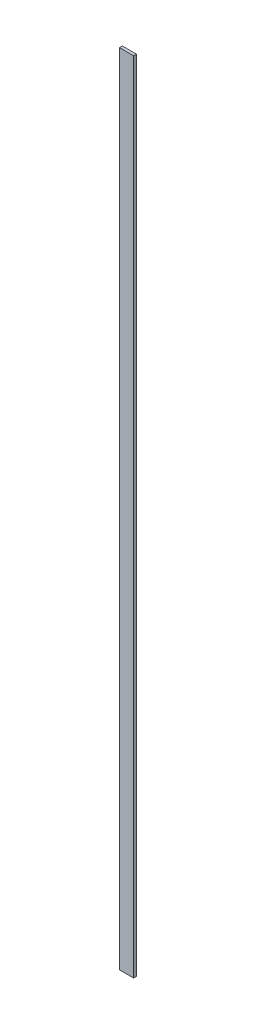
ISO-10303-21;
HEADER;
FILE_DESCRIPTION(('STEP AP214'),'2;1');
FILE_NAME('part.step','',(''),(''),'','','');
FILE_SCHEMA(('AUTOMOTIVE_DESIGN { 1 0 10303 214 1 1 1 1 }'));
ENDSEC;
DATA;
#1=APPLICATION_CONTEXT('core data for automotive mechanical design processes');
#2=APPLICATION_PROTOCOL_DEFINITION('international standard','automotive_design',2000,#1);
#3=PRODUCT_CONTEXT('',#1,'mechanical');
#4=PRODUCT('Part','Part','',(#3));
#5=PRODUCT_RELATED_PRODUCT_CATEGORY('part','',(#4));
#6=PRODUCT_DEFINITION_FORMATION('','',#4);
#7=PRODUCT_DEFINITION_CONTEXT('part definition',#1,'design');
#8=PRODUCT_DEFINITION('design','',#6,#7);
#9=PRODUCT_DEFINITION_SHAPE('','',#8);
#10=(LENGTH_UNIT() NAMED_UNIT(*) SI_UNIT(.MILLI.,.METRE.));
#11=(NAMED_UNIT(*) PLANE_ANGLE_UNIT() SI_UNIT($,.RADIAN.));
#12=(NAMED_UNIT(*) SI_UNIT($,.STERADIAN.) SOLID_ANGLE_UNIT());
#13=UNCERTAINTY_MEASURE_WITH_UNIT(LENGTH_MEASURE(1.E-05),#10,'distance_accuracy_value','');
#14=(GEOMETRIC_REPRESENTATION_CONTEXT(3) GLOBAL_UNCERTAINTY_ASSIGNED_CONTEXT((#13)) GLOBAL_UNIT_ASSIGNED_CONTEXT((#10,
#11,#12)) REPRESENTATION_CONTEXT('',''));
#15=CARTESIAN_POINT('',(0.,0.,0.));
#16=DIRECTION('',(0.,0.,1.));
#17=DIRECTION('',(1.,0.,0.));
#18=AXIS2_PLACEMENT_3D('',#15,#16,#17);
#19=CARTESIAN_POINT('',(20.,1140.,4.));
#20=DIRECTION('',(-1.,0.,0.));
#21=DIRECTION('',(0.,0.,1.));
#22=AXIS2_PLACEMENT_3D('',#19,#20,#21);
#23=PLANE('',#22);
#24=DIRECTION('',(0.,0.,-1.));
#25=VECTOR('',#24,1.);
#26=CARTESIAN_POINT('',(20.,-1140.,4.));
#27=LINE('',#26,#25);
#28=CARTESIAN_POINT('',(20.,-1140.,4.));
#29=VERTEX_POINT('',#28);
#30=CARTESIAN_POINT('',(20.,-1140.,-4.));
#31=VERTEX_POINT('',#30);
#32=EDGE_CURVE('E102',#29,#31,#27,.T.);
#33=ORIENTED_EDGE('',*,*,#32,.T.);
#34=DIRECTION('',(0.,-1.,0.));
#35=VECTOR('',#34,1.);
#36=CARTESIAN_POINT('',(20.,1140.,-4.));
#37=LINE('',#36,#35);
#38=CARTESIAN_POINT('',(20.,1140.,-4.));
#39=VERTEX_POINT('',#38);
#40=EDGE_CURVE('E11',#39,#31,#37,.T.);
#41=ORIENTED_EDGE('',*,*,#40,.F.);
#42=DIRECTION('',(0.,0.,-1.));
#43=VECTOR('',#42,1.);
#44=CARTESIAN_POINT('',(20.,1140.,4.));
#45=LINE('',#44,#43);
#46=CARTESIAN_POINT('',(20.,1140.,4.));
#47=VERTEX_POINT('',#46);
#48=EDGE_CURVE('E90',#47,#39,#45,.T.);
#49=ORIENTED_EDGE('',*,*,#48,.F.);
#50=DIRECTION('',(0.,-1.,0.));
#51=VECTOR('',#50,1.);
#52=CARTESIAN_POINT('',(20.,1140.,4.));
#53=LINE('',#52,#51);
#54=EDGE_CURVE('E98',#47,#29,#53,.T.);
#55=ORIENTED_EDGE('',*,*,#54,.T.);
#56=EDGE_LOOP('',(#33,#41,#49,#55));
#57=FACE_BOUND('',#56,.T.);
#58=ADVANCED_FACE('F39',(#57),#23,.F.);
#59=CARTESIAN_POINT('',(-20.,1140.,-4.));
#60=DIRECTION('',(0.,0.,1.));
#61=DIRECTION('',(1.,0.,0.));
#62=AXIS2_PLACEMENT_3D('',#59,#60,#61);
#63=PLANE('',#62);
#64=DIRECTION('',(-1.,0.,0.));
#65=VECTOR('',#64,1.);
#66=CARTESIAN_POINT('',(-20.,-1140.,-4.));
#67=LINE('',#66,#65);
#68=CARTESIAN_POINT('',(-20.,-1140.,-4.));
#69=VERTEX_POINT('',#68);
#70=EDGE_CURVE('E94',#31,#69,#67,.T.);
#71=ORIENTED_EDGE('',*,*,#70,.T.);
#72=DIRECTION('',(0.,-1.,0.));
#73=VECTOR('',#72,1.);
#74=CARTESIAN_POINT('',(-20.,1140.,-4.));
#75=LINE('',#74,#73);
#76=CARTESIAN_POINT('',(-20.,1140.,-4.));
#77=VERTEX_POINT('',#76);
#78=EDGE_CURVE('E47',#77,#69,#75,.T.);
#79=ORIENTED_EDGE('',*,*,#78,.F.);
#80=DIRECTION('',(-1.,0.,0.));
#81=VECTOR('',#80,1.);
#82=CARTESIAN_POINT('',(-20.,1140.,-4.));
#83=LINE('',#82,#81);
#84=EDGE_CURVE('E85',#39,#77,#83,.T.);
#85=ORIENTED_EDGE('',*,*,#84,.F.);
#86=ORIENTED_EDGE('',*,*,#40,.T.);
#87=EDGE_LOOP('',(#71,#79,#85,#86));
#88=FACE_BOUND('',#87,.T.);
#89=ADVANCED_FACE('F93',(#88),#63,.F.);
#90=CARTESIAN_POINT('',(-20.,1140.,4.));
#91=DIRECTION('',(1.,0.,0.));
#92=DIRECTION('',(0.,0.,-1.));
#93=AXIS2_PLACEMENT_3D('',#90,#91,#92);
#94=PLANE('',#93);
#95=DIRECTION('',(0.,0.,1.));
#96=VECTOR('',#95,1.);
#97=CARTESIAN_POINT('',(-20.,-1140.,4.));
#98=LINE('',#97,#96);
#99=CARTESIAN_POINT('',(-20.,-1140.,4.));
#100=VERTEX_POINT('',#99);
#101=EDGE_CURVE('E72',#69,#100,#98,.T.);
#102=ORIENTED_EDGE('',*,*,#101,.T.);
#103=DIRECTION('',(0.,-1.,0.));
#104=VECTOR('',#103,1.);
#105=CARTESIAN_POINT('',(-20.,1140.,4.));
#106=LINE('',#105,#104);
#107=CARTESIAN_POINT('',(-20.,1140.,4.));
#108=VERTEX_POINT('',#107);
#109=EDGE_CURVE('E95',#108,#100,#106,.T.);
#110=ORIENTED_EDGE('',*,*,#109,.F.);
#111=DIRECTION('',(0.,0.,1.));
#112=VECTOR('',#111,1.);
#113=CARTESIAN_POINT('',(-20.,1140.,4.));
#114=LINE('',#113,#112);
#115=EDGE_CURVE('E88',#77,#108,#114,.T.);
#116=ORIENTED_EDGE('',*,*,#115,.F.);
#117=ORIENTED_EDGE('',*,*,#78,.T.);
#118=EDGE_LOOP('',(#102,#110,#116,#117));
#119=FACE_BOUND('',#118,.T.);
#120=ADVANCED_FACE('F96',(#119),#94,.F.);
#121=CARTESIAN_POINT('',(-20.,1140.,4.));
#122=DIRECTION('',(0.,0.,-1.));
#123=DIRECTION('',(-1.,0.,0.));
#124=AXIS2_PLACEMENT_3D('',#121,#122,#123);
#125=PLANE('',#124);
#126=DIRECTION('',(1.,0.,0.));
#127=VECTOR('',#126,1.);
#128=CARTESIAN_POINT('',(-20.,-1140.,4.));
#129=LINE('',#128,#127);
#130=EDGE_CURVE('E78',#100,#29,#129,.T.);
#131=ORIENTED_EDGE('',*,*,#130,.T.);
#132=ORIENTED_EDGE('',*,*,#54,.F.);
#133=DIRECTION('',(1.,0.,0.));
#134=VECTOR('',#133,1.);
#135=CARTESIAN_POINT('',(-20.,1140.,4.));
#136=LINE('',#135,#134);
#137=EDGE_CURVE('E55',#108,#47,#136,.T.);
#138=ORIENTED_EDGE('',*,*,#137,.F.);
#139=ORIENTED_EDGE('',*,*,#109,.T.);
#140=EDGE_LOOP('',(#131,#132,#138,#139));
#141=FACE_BOUND('',#140,.T.);
#142=ADVANCED_FACE('F109',(#141),#125,.F.);
#143=CARTESIAN_POINT('',(0.,1140.,0.));
#144=DIRECTION('',(0.,-1.,0.));
#145=DIRECTION('',(0.,0.,-1.));
#146=AXIS2_PLACEMENT_3D('',#143,#144,#145);
#147=PLANE('',#146);
#148=ORIENTED_EDGE('',*,*,#48,.T.);
#149=ORIENTED_EDGE('',*,*,#84,.T.);
#150=ORIENTED_EDGE('',*,*,#115,.T.);
#151=ORIENTED_EDGE('',*,*,#137,.T.);
#152=EDGE_LOOP('',(#148,#149,#150,#151));
#153=FACE_BOUND('',#152,.T.);
#154=ADVANCED_FACE('F86',(#153),#147,.F.);
#155=CARTESIAN_POINT('',(0.,-1140.,0.));
#156=DIRECTION('',(0.,-1.,0.));
#157=DIRECTION('',(0.,0.,-1.));
#158=AXIS2_PLACEMENT_3D('',#155,#156,#157);
#159=PLANE('',#158);
#160=ORIENTED_EDGE('',*,*,#32,.F.);
#161=ORIENTED_EDGE('',*,*,#130,.F.);
#162=ORIENTED_EDGE('',*,*,#101,.F.);
#163=ORIENTED_EDGE('',*,*,#70,.F.);
#164=EDGE_LOOP('',(#160,#161,#162,#163));
#165=FACE_BOUND('',#164,.T.);
#166=ADVANCED_FACE('F112',(#165),#159,.T.);
#167=CLOSED_SHELL('',(#58,#89,#120,#142,#154,#166));
#168=MANIFOLD_SOLID_BREP('B2',#167);
#169=ADVANCED_BREP_SHAPE_REPRESENTATION('',(#18,#168),#14);
#170=SHAPE_DEFINITION_REPRESENTATION(#9,#169);
ENDSEC;
END-ISO-10303-21;
